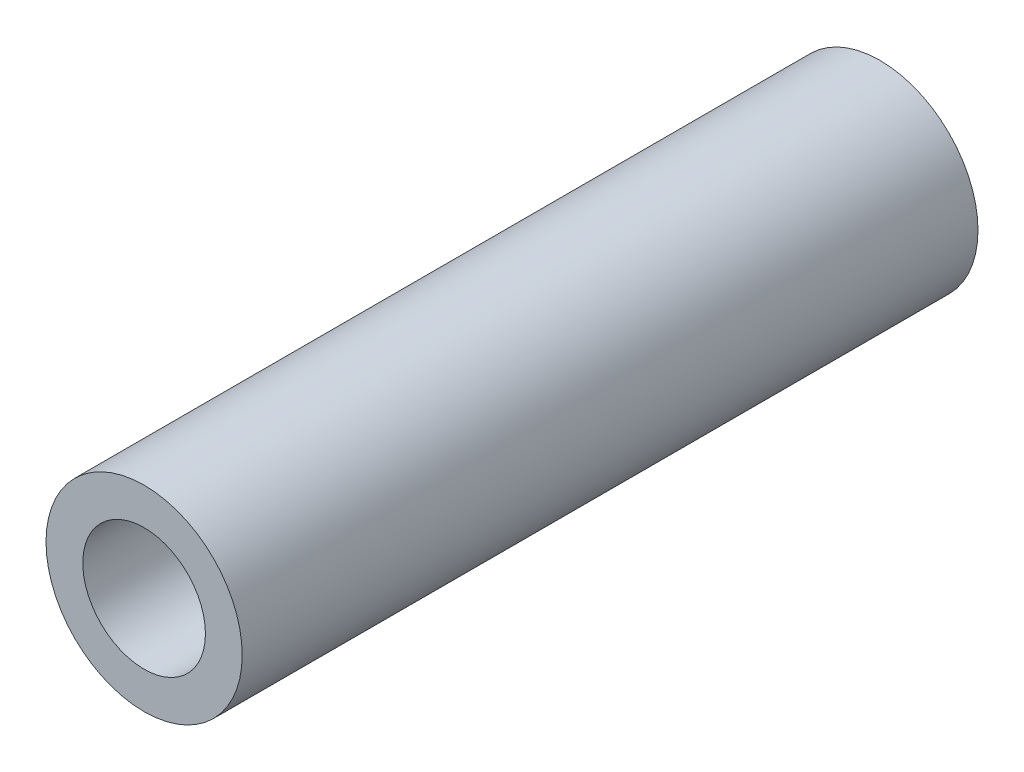
ISO-10303-21;
HEADER;
FILE_DESCRIPTION(('STEP AP214'),'2;1');
FILE_NAME('part.step','',(''),(''),'','','');
FILE_SCHEMA(('AUTOMOTIVE_DESIGN { 1 0 10303 214 1 1 1 1 }'));
ENDSEC;
DATA;
#1=APPLICATION_CONTEXT('core data for automotive mechanical design processes');
#2=APPLICATION_PROTOCOL_DEFINITION('international standard','automotive_design',2000,#1);
#3=PRODUCT_CONTEXT('',#1,'mechanical');
#4=PRODUCT('Part','Part','',(#3));
#5=PRODUCT_RELATED_PRODUCT_CATEGORY('part','',(#4));
#6=PRODUCT_DEFINITION_FORMATION('','',#4);
#7=PRODUCT_DEFINITION_CONTEXT('part definition',#1,'design');
#8=PRODUCT_DEFINITION('design','',#6,#7);
#9=PRODUCT_DEFINITION_SHAPE('','',#8);
#10=(LENGTH_UNIT() NAMED_UNIT(*) SI_UNIT(.MILLI.,.METRE.));
#11=(NAMED_UNIT(*) PLANE_ANGLE_UNIT() SI_UNIT($,.RADIAN.));
#12=(NAMED_UNIT(*) SI_UNIT($,.STERADIAN.) SOLID_ANGLE_UNIT());
#13=UNCERTAINTY_MEASURE_WITH_UNIT(LENGTH_MEASURE(1.E-05),#10,'distance_accuracy_value','');
#14=(GEOMETRIC_REPRESENTATION_CONTEXT(3) GLOBAL_UNCERTAINTY_ASSIGNED_CONTEXT((#13)) GLOBAL_UNIT_ASSIGNED_CONTEXT((#10,
#11,#12)) REPRESENTATION_CONTEXT('',''));
#15=CARTESIAN_POINT('',(0.,0.,0.));
#16=DIRECTION('',(0.,0.,1.));
#17=DIRECTION('',(1.,0.,0.));
#18=AXIS2_PLACEMENT_3D('',#15,#16,#17);
#19=CARTESIAN_POINT('',(0.,0.,6.35));
#20=DIRECTION('',(0.,0.,1.));
#21=DIRECTION('',(1.,0.,0.));
#22=AXIS2_PLACEMENT_3D('',#19,#20,#21);
#23=PLANE('',#22);
#24=CARTESIAN_POINT('',(0.,0.,6.35));
#25=DIRECTION('',(0.,0.,1.));
#26=DIRECTION('',(1.,0.,0.));
#27=AXIS2_PLACEMENT_3D('',#24,#25,#26);
#28=CIRCLE('',#27,8.73125);
#29=CARTESIAN_POINT('',(8.73125,0.,6.35));
#30=VERTEX_POINT('',#29);
#31=EDGE_CURVE('E50',#30,#30,#28,.T.);
#32=ORIENTED_EDGE('',*,*,#31,.F.);
#33=EDGE_LOOP('',(#32));
#34=FACE_BOUND('',#33,.T.);
#35=CARTESIAN_POINT('',(0.,0.,6.35));
#36=DIRECTION('',(0.,0.,1.));
#37=DIRECTION('',(1.,0.,0.));
#38=AXIS2_PLACEMENT_3D('',#35,#36,#37);
#39=CIRCLE('',#38,6.35);
#40=CARTESIAN_POINT('',(6.35,0.,6.35));
#41=VERTEX_POINT('',#40);
#42=EDGE_CURVE('E64',#41,#41,#39,.T.);
#43=ORIENTED_EDGE('',*,*,#42,.T.);
#44=EDGE_LOOP('',(#43));
#45=FACE_BOUND('',#44,.T.);
#46=ADVANCED_FACE('F35',(#34,#45),#23,.F.);
#47=CARTESIAN_POINT('',(0.,0.,0.));
#48=DIRECTION('',(0.,0.,1.));
#49=DIRECTION('',(1.,0.,0.));
#50=AXIS2_PLACEMENT_3D('',#47,#48,#49);
#51=PLANE('',#50);
#52=CARTESIAN_POINT('',(0.,0.,0.));
#53=DIRECTION('',(0.,0.,1.));
#54=DIRECTION('',(1.,0.,0.));
#55=AXIS2_PLACEMENT_3D('',#52,#53,#54);
#56=CIRCLE('',#55,12.7);
#57=CARTESIAN_POINT('',(12.7,0.,0.));
#58=VERTEX_POINT('',#57);
#59=EDGE_CURVE('E42',#58,#58,#56,.T.);
#60=ORIENTED_EDGE('',*,*,#59,.F.);
#61=EDGE_LOOP('',(#60));
#62=FACE_BOUND('',#61,.T.);
#63=CARTESIAN_POINT('',(0.,0.,0.));
#64=DIRECTION('',(0.,0.,1.));
#65=DIRECTION('',(1.,0.,0.));
#66=AXIS2_PLACEMENT_3D('',#63,#64,#65);
#67=CIRCLE('',#66,8.73125);
#68=CARTESIAN_POINT('',(8.73125,0.,0.));
#69=VERTEX_POINT('',#68);
#70=EDGE_CURVE('E46',#69,#69,#67,.T.);
#71=ORIENTED_EDGE('',*,*,#70,.T.);
#72=EDGE_LOOP('',(#71));
#73=FACE_BOUND('',#72,.T.);
#74=ADVANCED_FACE('F89',(#62,#73),#51,.F.);
#75=CARTESIAN_POINT('',(0.,0.,6.35));
#76=DIRECTION('',(0.,0.,-1.));
#77=DIRECTION('',(-1.,0.,0.));
#78=AXIS2_PLACEMENT_3D('',#75,#76,#77);
#79=CYLINDRICAL_SURFACE('',#78,12.7);
#80=ORIENTED_EDGE('',*,*,#59,.T.);
#81=EDGE_LOOP('',(#80));
#82=FACE_BOUND('',#81,.T.);
#83=CARTESIAN_POINT('',(0.,0.,95.25));
#84=DIRECTION('',(0.,0.,1.));
#85=DIRECTION('',(1.,0.,0.));
#86=AXIS2_PLACEMENT_3D('',#83,#84,#85);
#87=CIRCLE('',#86,12.7);
#88=CARTESIAN_POINT('',(12.7,0.,95.25));
#89=VERTEX_POINT('',#88);
#90=EDGE_CURVE('E55',#89,#89,#87,.T.);
#91=ORIENTED_EDGE('',*,*,#90,.F.);
#92=EDGE_LOOP('',(#91));
#93=FACE_BOUND('',#92,.T.);
#94=ADVANCED_FACE('F37',(#82,#93),#79,.T.);
#95=CARTESIAN_POINT('',(0.,0.,6.35));
#96=DIRECTION('',(0.,0.,-1.));
#97=DIRECTION('',(-1.,0.,0.));
#98=AXIS2_PLACEMENT_3D('',#95,#96,#97);
#99=CYLINDRICAL_SURFACE('',#98,8.73125);
#100=ORIENTED_EDGE('',*,*,#31,.T.);
#101=EDGE_LOOP('',(#100));
#102=FACE_BOUND('',#101,.T.);
#103=ORIENTED_EDGE('',*,*,#70,.F.);
#104=EDGE_LOOP('',(#103));
#105=FACE_BOUND('',#104,.T.);
#106=ADVANCED_FACE('F98',(#102,#105),#99,.F.);
#107=CARTESIAN_POINT('',(0.,0.,95.25));
#108=DIRECTION('',(0.,0.,1.));
#109=DIRECTION('',(1.,0.,0.));
#110=AXIS2_PLACEMENT_3D('',#107,#108,#109);
#111=PLANE('',#110);
#112=ORIENTED_EDGE('',*,*,#90,.T.);
#113=EDGE_LOOP('',(#112));
#114=FACE_BOUND('',#113,.T.);
#115=CARTESIAN_POINT('',(0.,0.,95.25));
#116=DIRECTION('',(0.,0.,1.));
#117=DIRECTION('',(1.,0.,0.));
#118=AXIS2_PLACEMENT_3D('',#115,#116,#117);
#119=CIRCLE('',#118,7.9375);
#120=CARTESIAN_POINT('',(7.9375,0.,95.25));
#121=VERTEX_POINT('',#120);
#122=EDGE_CURVE('E58',#121,#121,#119,.T.);
#123=ORIENTED_EDGE('',*,*,#122,.F.);
#124=EDGE_LOOP('',(#123));
#125=FACE_BOUND('',#124,.T.);
#126=ADVANCED_FACE('F83',(#114,#125),#111,.T.);
#127=CARTESIAN_POINT('',(0.,0.,95.25));
#128=DIRECTION('',(0.,0.,-1.));
#129=DIRECTION('',(-1.,0.,0.));
#130=AXIS2_PLACEMENT_3D('',#127,#128,#129);
#131=CYLINDRICAL_SURFACE('',#130,7.9375);
#132=ORIENTED_EDGE('',*,*,#122,.T.);
#133=EDGE_LOOP('',(#132));
#134=FACE_BOUND('',#133,.T.);
#135=CARTESIAN_POINT('',(0.,0.,71.4375));
#136=DIRECTION('',(0.,0.,1.));
#137=DIRECTION('',(1.,0.,0.));
#138=AXIS2_PLACEMENT_3D('',#135,#136,#137);
#139=CIRCLE('',#138,7.9375);
#140=CARTESIAN_POINT('',(7.9375,0.,71.4375));
#141=VERTEX_POINT('',#140);
#142=EDGE_CURVE('E11',#141,#141,#139,.F.);
#143=ORIENTED_EDGE('',*,*,#142,.T.);
#144=EDGE_LOOP('',(#143));
#145=FACE_BOUND('',#144,.T.);
#146=ADVANCED_FACE('F78',(#134,#145),#131,.F.);
#147=CARTESIAN_POINT('',(0.,0.,71.4375));
#148=DIRECTION('',(0.,0.,1.));
#149=DIRECTION('',(1.,0.,0.));
#150=AXIS2_PLACEMENT_3D('',#147,#148,#149);
#151=PLANE('',#150);
#152=CARTESIAN_POINT('',(0.,0.,71.4375));
#153=DIRECTION('',(0.,0.,-1.));
#154=DIRECTION('',(-1.,0.,0.));
#155=AXIS2_PLACEMENT_3D('',#152,#153,#154);
#156=CIRCLE('',#155,4.7625);
#157=CARTESIAN_POINT('',(-4.7625,0.,71.4375));
#158=VERTEX_POINT('',#157);
#159=EDGE_CURVE('E61',#158,#158,#156,.T.);
#160=ORIENTED_EDGE('',*,*,#159,.T.);
#161=EDGE_LOOP('',(#160));
#162=FACE_BOUND('',#161,.T.);
#163=ORIENTED_EDGE('',*,*,#142,.F.);
#164=EDGE_LOOP('',(#163));
#165=FACE_BOUND('',#164,.T.);
#166=ADVANCED_FACE('F72',(#162,#165),#151,.T.);
#167=CARTESIAN_POINT('',(0.,0.,71.4375));
#168=DIRECTION('',(0.,0.,-1.));
#169=DIRECTION('',(-1.,0.,0.));
#170=AXIS2_PLACEMENT_3D('',#167,#168,#169);
#171=CONICAL_SURFACE('',#170,4.7625,0.0243854091727185);
#172=ORIENTED_EDGE('',*,*,#42,.F.);
#173=EDGE_LOOP('',(#172));
#174=FACE_BOUND('',#173,.T.);
#175=ORIENTED_EDGE('',*,*,#159,.F.);
#176=EDGE_LOOP('',(#175));
#177=FACE_BOUND('',#176,.T.);
#178=ADVANCED_FACE('F69',(#174,#177),#171,.F.);
#179=CLOSED_SHELL('',(#46,#74,#94,#106,#126,#146,#166,#178));
#180=MANIFOLD_SOLID_BREP('B2',#179);
#181=ADVANCED_BREP_SHAPE_REPRESENTATION('',(#18,#180),#14);
#182=SHAPE_DEFINITION_REPRESENTATION(#9,#181);
ENDSEC;
END-ISO-10303-21;
